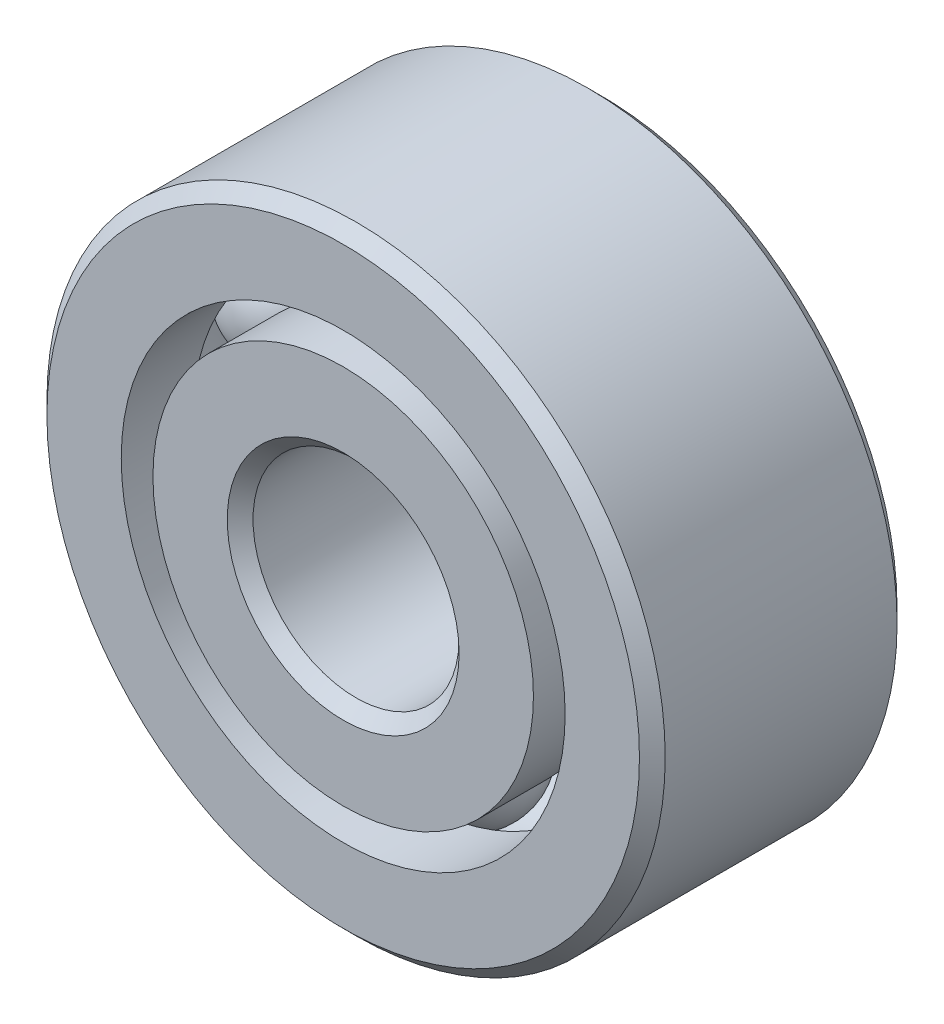
ISO-10303-21;
HEADER;
FILE_DESCRIPTION(('STEP AP214'),'2;1');
FILE_NAME('part.step','',(''),(''),'','','');
FILE_SCHEMA(('AUTOMOTIVE_DESIGN { 1 0 10303 214 1 1 1 1 }'));
ENDSEC;
DATA;
#1=APPLICATION_CONTEXT('core data for automotive mechanical design processes');
#2=APPLICATION_PROTOCOL_DEFINITION('international standard','automotive_design',2000,#1);
#3=PRODUCT_CONTEXT('',#1,'mechanical');
#4=PRODUCT('Part','Part','',(#3));
#5=PRODUCT_RELATED_PRODUCT_CATEGORY('part','',(#4));
#6=PRODUCT_DEFINITION_FORMATION('','',#4);
#7=PRODUCT_DEFINITION_CONTEXT('part definition',#1,'design');
#8=PRODUCT_DEFINITION('design','',#6,#7);
#9=PRODUCT_DEFINITION_SHAPE('','',#8);
#10=(LENGTH_UNIT() NAMED_UNIT(*) SI_UNIT(.MILLI.,.METRE.));
#11=(NAMED_UNIT(*) PLANE_ANGLE_UNIT() SI_UNIT($,.RADIAN.));
#12=(NAMED_UNIT(*) SI_UNIT($,.STERADIAN.) SOLID_ANGLE_UNIT());
#13=UNCERTAINTY_MEASURE_WITH_UNIT(LENGTH_MEASURE(1.E-05),#10,'distance_accuracy_value','');
#14=(GEOMETRIC_REPRESENTATION_CONTEXT(3) GLOBAL_UNCERTAINTY_ASSIGNED_CONTEXT((#13)) GLOBAL_UNIT_ASSIGNED_CONTEXT((#10,
#11,#12)) REPRESENTATION_CONTEXT('',''));
#15=CARTESIAN_POINT('',(0.,0.,0.));
#16=DIRECTION('',(0.,0.,1.));
#17=DIRECTION('',(1.,0.,0.));
#18=AXIS2_PLACEMENT_3D('',#15,#16,#17);
#19=CARTESIAN_POINT('',(-2.74963065701557,1.58750000000003,0.));
#20=DIRECTION('',(0.,0.,1.));
#21=DIRECTION('',(-0.866025403784433,0.50000000000001,0.));
#22=AXIS2_PLACEMENT_3D('',#19,#20,#21);
#23=SPHERICAL_SURFACE('',#22,0.915136422466876);
#24=CARTESIAN_POINT('',(-2.74963065701557,1.58750000000003,0.915136422466875));
#25=VERTEX_POINT('',#24);
#26=VERTEX_LOOP('',#25);
#27=FACE_BOUND('',#26,.T.);
#28=ADVANCED_FACE('F45',(#27),#23,.T.);
#29=CLOSED_SHELL('',(#28));
#30=MANIFOLD_SOLID_BREP('B2',#29);
#31=CARTESIAN_POINT('',(-2.74963065701561,-1.58749999999997,0.));
#32=DIRECTION('',(0.,0.,1.));
#33=DIRECTION('',(-0.866025403784443,-0.499999999999992,0.));
#34=AXIS2_PLACEMENT_3D('',#31,#32,#33);
#35=SPHERICAL_SURFACE('',#34,0.915136422466876);
#36=CARTESIAN_POINT('',(-2.74963065701561,-1.58749999999997,0.915136422466875));
#37=VERTEX_POINT('',#36);
#38=VERTEX_LOOP('',#37);
#39=FACE_BOUND('',#38,.T.);
#40=ADVANCED_FACE('F65',(#39),#35,.T.);
#41=CLOSED_SHELL('',(#40));
#42=MANIFOLD_SOLID_BREP('B6',#41);
#43=CARTESIAN_POINT('',(0.,-3.175,0.));
#44=DIRECTION('',(0.,0.,1.));
#45=DIRECTION('',(0.,-1.,0.));
#46=AXIS2_PLACEMENT_3D('',#43,#44,#45);
#47=SPHERICAL_SURFACE('',#46,0.915136422466876);
#48=CARTESIAN_POINT('',(0.,-3.175,0.915136422466875));
#49=VERTEX_POINT('',#48);
#50=VERTEX_LOOP('',#49);
#51=FACE_BOUND('',#50,.T.);
#52=ADVANCED_FACE('F85',(#51),#47,.T.);
#53=CLOSED_SHELL('',(#52));
#54=MANIFOLD_SOLID_BREP('B41',#53);
#55=CARTESIAN_POINT('',(2.74963065701559,-1.58750000000001,0.));
#56=DIRECTION('',(0.,0.,1.));
#57=DIRECTION('',(0.866025403784436,-0.500000000000004,0.));
#58=AXIS2_PLACEMENT_3D('',#55,#56,#57);
#59=SPHERICAL_SURFACE('',#58,0.915136422466876);
#60=CARTESIAN_POINT('',(2.74963065701559,-1.58750000000001,0.915136422466875));
#61=VERTEX_POINT('',#60);
#62=VERTEX_LOOP('',#61);
#63=FACE_BOUND('',#62,.T.);
#64=ADVANCED_FACE('F105',(#63),#59,.T.);
#65=CLOSED_SHELL('',(#64));
#66=MANIFOLD_SOLID_BREP('B61',#65);
#67=CARTESIAN_POINT('',(2.7496306570156,1.58749999999999,0.));
#68=DIRECTION('',(0.,0.,1.));
#69=DIRECTION('',(0.86602540378444,0.499999999999998,0.));
#70=AXIS2_PLACEMENT_3D('',#67,#68,#69);
#71=SPHERICAL_SURFACE('',#70,0.915136422466876);
#72=CARTESIAN_POINT('',(2.7496306570156,1.58749999999999,0.915136422466875));
#73=VERTEX_POINT('',#72);
#74=VERTEX_LOOP('',#73);
#75=FACE_BOUND('',#74,.T.);
#76=ADVANCED_FACE('F125',(#75),#71,.T.);
#77=CLOSED_SHELL('',(#76));
#78=MANIFOLD_SOLID_BREP('B81',#77);
#79=CARTESIAN_POINT('',(0.,3.175,0.));
#80=DIRECTION('',(0.,0.,1.));
#81=DIRECTION('',(0.,1.,0.));
#82=AXIS2_PLACEMENT_3D('',#79,#80,#81);
#83=SPHERICAL_SURFACE('',#82,0.915136422466876);
#84=CARTESIAN_POINT('',(0.,3.175,0.915136422466875));
#85=VERTEX_POINT('',#84);
#86=VERTEX_LOOP('',#85);
#87=FACE_BOUND('',#86,.T.);
#88=ADVANCED_FACE('F149',(#87),#83,.T.);
#89=CLOSED_SHELL('',(#88));
#90=MANIFOLD_SOLID_BREP('B101',#89);
#91=CARTESIAN_POINT('',(0.,2.93076923076923,1.984375));
#92=DIRECTION('',(0.,0.,-1.));
#93=DIRECTION('',(-1.,0.,0.));
#94=AXIS2_PLACEMENT_3D('',#91,#92,#93);
#95=PLANE('',#94);
#96=CARTESIAN_POINT('',(0.,0.,1.984375));
#97=DIRECTION('',(0.,0.,1.));
#98=DIRECTION('',(1.,0.,0.));
#99=AXIS2_PLACEMENT_3D('',#96,#97,#98);
#100=CIRCLE('',#99,1.7859375);
#101=CARTESIAN_POINT('',(1.7859375,0.,1.984375));
#102=VERTEX_POINT('',#101);
#103=EDGE_CURVE('E204',#102,#102,#100,.T.);
#104=ORIENTED_EDGE('',*,*,#103,.F.);
#105=EDGE_LOOP('',(#104));
#106=FACE_BOUND('',#105,.T.);
#107=CARTESIAN_POINT('',(0.,0.,1.984375));
#108=DIRECTION('',(0.,0.,1.));
#109=DIRECTION('',(1.,0.,0.));
#110=AXIS2_PLACEMENT_3D('',#107,#108,#109);
#111=CIRCLE('',#110,2.93076923076923);
#112=CARTESIAN_POINT('',(2.93076923076923,0.,1.984375));
#113=VERTEX_POINT('',#112);
#114=EDGE_CURVE('E148',#113,#113,#111,.T.);
#115=ORIENTED_EDGE('',*,*,#114,.T.);
#116=EDGE_LOOP('',(#115));
#117=FACE_BOUND('',#116,.T.);
#118=ADVANCED_FACE('F176',(#106,#117),#95,.F.);
#119=CARTESIAN_POINT('',(0.,0.,1.984375));
#120=DIRECTION('',(0.,0.,1.));
#121=DIRECTION('',(1.,0.,0.));
#122=AXIS2_PLACEMENT_3D('',#119,#120,#121);
#123=CYLINDRICAL_SURFACE('',#122,2.93076923076923);
#124=ORIENTED_EDGE('',*,*,#114,.F.);
#125=EDGE_LOOP('',(#124));
#126=FACE_BOUND('',#125,.T.);
#127=CARTESIAN_POINT('',(0.,0.,0.881944444444444));
#128=DIRECTION('',(0.,0.,1.));
#129=DIRECTION('',(1.,0.,0.));
#130=AXIS2_PLACEMENT_3D('',#127,#128,#129);
#131=CIRCLE('',#130,2.93076923076923);
#132=CARTESIAN_POINT('',(2.93076923076923,0.,0.881944444444444));
#133=VERTEX_POINT('',#132);
#134=EDGE_CURVE('E182',#133,#133,#131,.T.);
#135=ORIENTED_EDGE('',*,*,#134,.T.);
#136=EDGE_LOOP('',(#135));
#137=FACE_BOUND('',#136,.T.);
#138=ADVANCED_FACE('F211',(#126,#137),#123,.T.);
#139=CARTESIAN_POINT('',(0.,0.,0.));
#140=DIRECTION('',(0.,0.,1.));
#141=DIRECTION('',(1.,0.,0.));
#142=AXIS2_PLACEMENT_3D('',#139,#140,#141);
#143=TOROIDAL_SURFACE('',#142,3.175,0.915136422466874);
#144=ORIENTED_EDGE('',*,*,#134,.F.);
#145=EDGE_LOOP('',(#144));
#146=FACE_BOUND('',#145,.T.);
#147=CARTESIAN_POINT('',(0.,0.,-0.881944444444445));
#148=DIRECTION('',(0.,0.,1.));
#149=DIRECTION('',(1.,0.,0.));
#150=AXIS2_PLACEMENT_3D('',#147,#148,#149);
#151=CIRCLE('',#150,2.93076923076923);
#152=CARTESIAN_POINT('',(2.93076923076923,0.,-0.881944444444445));
#153=VERTEX_POINT('',#152);
#154=EDGE_CURVE('E186',#153,#153,#151,.T.);
#155=ORIENTED_EDGE('',*,*,#154,.T.);
#156=EDGE_LOOP('',(#155));
#157=FACE_BOUND('',#156,.T.);
#158=ADVANCED_FACE('F215',(#146,#157),#143,.F.);
#159=CARTESIAN_POINT('',(0.,0.,1.984375));
#160=DIRECTION('',(0.,0.,1.));
#161=DIRECTION('',(1.,0.,0.));
#162=AXIS2_PLACEMENT_3D('',#159,#160,#161);
#163=CYLINDRICAL_SURFACE('',#162,2.93076923076923);
#164=ORIENTED_EDGE('',*,*,#154,.F.);
#165=EDGE_LOOP('',(#164));
#166=FACE_BOUND('',#165,.T.);
#167=CARTESIAN_POINT('',(0.,0.,-1.984375));
#168=DIRECTION('',(0.,0.,1.));
#169=DIRECTION('',(1.,0.,0.));
#170=AXIS2_PLACEMENT_3D('',#167,#168,#169);
#171=CIRCLE('',#170,2.93076923076923);
#172=CARTESIAN_POINT('',(2.93076923076923,0.,-1.984375));
#173=VERTEX_POINT('',#172);
#174=EDGE_CURVE('E190',#173,#173,#171,.T.);
#175=ORIENTED_EDGE('',*,*,#174,.T.);
#176=EDGE_LOOP('',(#175));
#177=FACE_BOUND('',#176,.T.);
#178=ADVANCED_FACE('F220',(#166,#177),#163,.T.);
#179=CARTESIAN_POINT('',(0.,1.7859375,-1.984375));
#180=DIRECTION('',(0.,0.,1.));
#181=DIRECTION('',(1.,0.,0.));
#182=AXIS2_PLACEMENT_3D('',#179,#180,#181);
#183=PLANE('',#182);
#184=ORIENTED_EDGE('',*,*,#174,.F.);
#185=EDGE_LOOP('',(#184));
#186=FACE_BOUND('',#185,.T.);
#187=CARTESIAN_POINT('',(0.,0.,-1.984375));
#188=DIRECTION('',(0.,0.,1.));
#189=DIRECTION('',(1.,0.,0.));
#190=AXIS2_PLACEMENT_3D('',#187,#188,#189);
#191=CIRCLE('',#190,1.7859375);
#192=CARTESIAN_POINT('',(1.7859375,0.,-1.984375));
#193=VERTEX_POINT('',#192);
#194=EDGE_CURVE('E195',#193,#193,#191,.T.);
#195=ORIENTED_EDGE('',*,*,#194,.T.);
#196=EDGE_LOOP('',(#195));
#197=FACE_BOUND('',#196,.T.);
#198=ADVANCED_FACE('F226',(#186,#197),#183,.F.);
#199=CARTESIAN_POINT('',(0.,0.,-1.7859375));
#200=DIRECTION('',(0.,0.,-1.));
#201=DIRECTION('',(-1.,0.,0.));
#202=AXIS2_PLACEMENT_3D('',#199,#200,#201);
#203=CONICAL_SURFACE('',#202,1.5875,0.785398163397443);
#204=ORIENTED_EDGE('',*,*,#194,.F.);
#205=EDGE_LOOP('',(#204));
#206=FACE_BOUND('',#205,.T.);
#207=CARTESIAN_POINT('',(0.,0.,-1.7859375));
#208=DIRECTION('',(0.,0.,1.));
#209=DIRECTION('',(1.,0.,0.));
#210=AXIS2_PLACEMENT_3D('',#207,#208,#209);
#211=CIRCLE('',#210,1.5875);
#212=CARTESIAN_POINT('',(1.5875,0.,-1.7859375));
#213=VERTEX_POINT('',#212);
#214=EDGE_CURVE('E198',#213,#213,#211,.T.);
#215=ORIENTED_EDGE('',*,*,#214,.T.);
#216=EDGE_LOOP('',(#215));
#217=FACE_BOUND('',#216,.T.);
#218=ADVANCED_FACE('F230',(#206,#217),#203,.F.);
#219=CARTESIAN_POINT('',(0.,0.,1.984375));
#220=DIRECTION('',(0.,0.,1.));
#221=DIRECTION('',(1.,0.,0.));
#222=AXIS2_PLACEMENT_3D('',#219,#220,#221);
#223=CYLINDRICAL_SURFACE('',#222,1.5875);
#224=ORIENTED_EDGE('',*,*,#214,.F.);
#225=EDGE_LOOP('',(#224));
#226=FACE_BOUND('',#225,.T.);
#227=CARTESIAN_POINT('',(0.,0.,1.7859375));
#228=DIRECTION('',(0.,0.,1.));
#229=DIRECTION('',(1.,0.,0.));
#230=AXIS2_PLACEMENT_3D('',#227,#228,#229);
#231=CIRCLE('',#230,1.5875);
#232=CARTESIAN_POINT('',(1.5875,0.,1.7859375));
#233=VERTEX_POINT('',#232);
#234=EDGE_CURVE('E201',#233,#233,#231,.T.);
#235=ORIENTED_EDGE('',*,*,#234,.T.);
#236=EDGE_LOOP('',(#235));
#237=FACE_BOUND('',#236,.T.);
#238=ADVANCED_FACE('F234',(#226,#237),#223,.F.);
#239=CARTESIAN_POINT('',(0.,0.,1.984375));
#240=DIRECTION('',(0.,0.,1.));
#241=DIRECTION('',(1.,0.,0.));
#242=AXIS2_PLACEMENT_3D('',#239,#240,#241);
#243=CONICAL_SURFACE('',#242,1.7859375,0.785398163397453);
#244=ORIENTED_EDGE('',*,*,#234,.F.);
#245=EDGE_LOOP('',(#244));
#246=FACE_BOUND('',#245,.T.);
#247=ORIENTED_EDGE('',*,*,#103,.T.);
#248=EDGE_LOOP('',(#247));
#249=FACE_BOUND('',#248,.T.);
#250=ADVANCED_FACE('F208',(#246,#249),#243,.F.);
#251=CLOSED_SHELL('',(#118,#138,#158,#178,#198,#218,#238,#250));
#252=MANIFOLD_SOLID_BREP('B121',#251);
#253=CARTESIAN_POINT('',(0.,0.,1.7859375));
#254=DIRECTION('',(0.,0.,-1.));
#255=DIRECTION('',(-1.,0.,0.));
#256=AXIS2_PLACEMENT_3D('',#253,#254,#255);
#257=CONICAL_SURFACE('',#256,4.7625,0.785398163397445);
#258=CARTESIAN_POINT('',(0.,0.,1.984375));
#259=DIRECTION('',(0.,0.,1.));
#260=DIRECTION('',(1.,0.,0.));
#261=AXIS2_PLACEMENT_3D('',#258,#259,#260);
#262=CIRCLE('',#261,4.5640625);
#263=CARTESIAN_POINT('',(4.5640625,0.,1.984375));
#264=VERTEX_POINT('',#263);
#265=EDGE_CURVE('E331',#264,#264,#262,.T.);
#266=ORIENTED_EDGE('',*,*,#265,.F.);
#267=EDGE_LOOP('',(#266));
#268=FACE_BOUND('',#267,.T.);
#269=CARTESIAN_POINT('',(0.,0.,1.7859375));
#270=DIRECTION('',(0.,0.,1.));
#271=DIRECTION('',(1.,0.,0.));
#272=AXIS2_PLACEMENT_3D('',#269,#270,#271);
#273=CIRCLE('',#272,4.7625);
#274=CARTESIAN_POINT('',(4.7625,0.,1.7859375));
#275=VERTEX_POINT('',#274);
#276=EDGE_CURVE('E175',#275,#275,#273,.T.);
#277=ORIENTED_EDGE('',*,*,#276,.T.);
#278=EDGE_LOOP('',(#277));
#279=FACE_BOUND('',#278,.T.);
#280=ADVANCED_FACE('F303',(#268,#279),#257,.T.);
#281=CARTESIAN_POINT('',(0.,0.,1.984375));
#282=DIRECTION('',(0.,0.,1.));
#283=DIRECTION('',(1.,0.,0.));
#284=AXIS2_PLACEMENT_3D('',#281,#282,#283);
#285=CYLINDRICAL_SURFACE('',#284,4.7625);
#286=ORIENTED_EDGE('',*,*,#276,.F.);
#287=EDGE_LOOP('',(#286));
#288=FACE_BOUND('',#287,.T.);
#289=CARTESIAN_POINT('',(0.,0.,-1.7859375));
#290=DIRECTION('',(0.,0.,1.));
#291=DIRECTION('',(1.,0.,0.));
#292=AXIS2_PLACEMENT_3D('',#289,#290,#291);
#293=CIRCLE('',#292,4.7625);
#294=CARTESIAN_POINT('',(4.7625,0.,-1.7859375));
#295=VERTEX_POINT('',#294);
#296=EDGE_CURVE('E309',#295,#295,#293,.T.);
#297=ORIENTED_EDGE('',*,*,#296,.T.);
#298=EDGE_LOOP('',(#297));
#299=FACE_BOUND('',#298,.T.);
#300=ADVANCED_FACE('F338',(#288,#299),#285,.T.);
#301=CARTESIAN_POINT('',(0.,0.,-1.984375));
#302=DIRECTION('',(0.,0.,1.));
#303=DIRECTION('',(1.,0.,0.));
#304=AXIS2_PLACEMENT_3D('',#301,#302,#303);
#305=CONICAL_SURFACE('',#304,4.5640625,0.785398163397444);
#306=ORIENTED_EDGE('',*,*,#296,.F.);
#307=EDGE_LOOP('',(#306));
#308=FACE_BOUND('',#307,.T.);
#309=CARTESIAN_POINT('',(0.,0.,-1.984375));
#310=DIRECTION('',(0.,0.,1.));
#311=DIRECTION('',(1.,0.,0.));
#312=AXIS2_PLACEMENT_3D('',#309,#310,#311);
#313=CIRCLE('',#312,4.5640625);
#314=CARTESIAN_POINT('',(4.5640625,0.,-1.984375));
#315=VERTEX_POINT('',#314);
#316=EDGE_CURVE('E313',#315,#315,#313,.T.);
#317=ORIENTED_EDGE('',*,*,#316,.T.);
#318=EDGE_LOOP('',(#317));
#319=FACE_BOUND('',#318,.T.);
#320=ADVANCED_FACE('F342',(#308,#319),#305,.T.);
#321=CARTESIAN_POINT('',(0.,4.5640625,-1.984375));
#322=DIRECTION('',(0.,0.,1.));
#323=DIRECTION('',(1.,0.,0.));
#324=AXIS2_PLACEMENT_3D('',#321,#322,#323);
#325=PLANE('',#324);
#326=ORIENTED_EDGE('',*,*,#316,.F.);
#327=EDGE_LOOP('',(#326));
#328=FACE_BOUND('',#327,.T.);
#329=CARTESIAN_POINT('',(0.,0.,-1.984375));
#330=DIRECTION('',(0.,0.,1.));
#331=DIRECTION('',(1.,0.,0.));
#332=AXIS2_PLACEMENT_3D('',#329,#330,#331);
#333=CIRCLE('',#332,3.41923076923077);
#334=CARTESIAN_POINT('',(3.41923076923077,0.,-1.984375));
#335=VERTEX_POINT('',#334);
#336=EDGE_CURVE('E317',#335,#335,#333,.T.);
#337=ORIENTED_EDGE('',*,*,#336,.T.);
#338=EDGE_LOOP('',(#337));
#339=FACE_BOUND('',#338,.T.);
#340=ADVANCED_FACE('F347',(#328,#339),#325,.F.);
#341=CARTESIAN_POINT('',(0.,0.,1.984375));
#342=DIRECTION('',(0.,0.,1.));
#343=DIRECTION('',(1.,0.,0.));
#344=AXIS2_PLACEMENT_3D('',#341,#342,#343);
#345=CYLINDRICAL_SURFACE('',#344,3.41923076923077);
#346=ORIENTED_EDGE('',*,*,#336,.F.);
#347=EDGE_LOOP('',(#346));
#348=FACE_BOUND('',#347,.T.);
#349=CARTESIAN_POINT('',(0.,0.,-0.881944444444445));
#350=DIRECTION('',(0.,0.,1.));
#351=DIRECTION('',(1.,0.,0.));
#352=AXIS2_PLACEMENT_3D('',#349,#350,#351);
#353=CIRCLE('',#352,3.41923076923077);
#354=CARTESIAN_POINT('',(3.41923076923077,0.,-0.881944444444445));
#355=VERTEX_POINT('',#354);
#356=EDGE_CURVE('E322',#355,#355,#353,.T.);
#357=ORIENTED_EDGE('',*,*,#356,.T.);
#358=EDGE_LOOP('',(#357));
#359=FACE_BOUND('',#358,.T.);
#360=ADVANCED_FACE('F353',(#348,#359),#345,.F.);
#361=CARTESIAN_POINT('',(0.,0.,0.));
#362=DIRECTION('',(0.,0.,1.));
#363=DIRECTION('',(1.,0.,0.));
#364=AXIS2_PLACEMENT_3D('',#361,#362,#363);
#365=TOROIDAL_SURFACE('',#364,3.175,0.915136422466876);
#366=ORIENTED_EDGE('',*,*,#356,.F.);
#367=EDGE_LOOP('',(#366));
#368=FACE_BOUND('',#367,.T.);
#369=CARTESIAN_POINT('',(0.,0.,0.881944444444444));
#370=DIRECTION('',(0.,0.,1.));
#371=DIRECTION('',(1.,0.,0.));
#372=AXIS2_PLACEMENT_3D('',#369,#370,#371);
#373=CIRCLE('',#372,3.41923076923077);
#374=CARTESIAN_POINT('',(3.41923076923077,0.,0.881944444444444));
#375=VERTEX_POINT('',#374);
#376=EDGE_CURVE('E325',#375,#375,#373,.T.);
#377=ORIENTED_EDGE('',*,*,#376,.T.);
#378=EDGE_LOOP('',(#377));
#379=FACE_BOUND('',#378,.T.);
#380=ADVANCED_FACE('F357',(#368,#379),#365,.F.);
#381=CARTESIAN_POINT('',(0.,0.,1.984375));
#382=DIRECTION('',(0.,0.,1.));
#383=DIRECTION('',(1.,0.,0.));
#384=AXIS2_PLACEMENT_3D('',#381,#382,#383);
#385=CYLINDRICAL_SURFACE('',#384,3.41923076923077);
#386=ORIENTED_EDGE('',*,*,#376,.F.);
#387=EDGE_LOOP('',(#386));
#388=FACE_BOUND('',#387,.T.);
#389=CARTESIAN_POINT('',(0.,0.,1.984375));
#390=DIRECTION('',(0.,0.,1.));
#391=DIRECTION('',(1.,0.,0.));
#392=AXIS2_PLACEMENT_3D('',#389,#390,#391);
#393=CIRCLE('',#392,3.41923076923077);
#394=CARTESIAN_POINT('',(3.41923076923077,0.,1.984375));
#395=VERTEX_POINT('',#394);
#396=EDGE_CURVE('E328',#395,#395,#393,.T.);
#397=ORIENTED_EDGE('',*,*,#396,.T.);
#398=EDGE_LOOP('',(#397));
#399=FACE_BOUND('',#398,.T.);
#400=ADVANCED_FACE('F361',(#388,#399),#385,.F.);
#401=CARTESIAN_POINT('',(0.,4.5640625,1.984375));
#402=DIRECTION('',(0.,0.,-1.));
#403=DIRECTION('',(-1.,0.,0.));
#404=AXIS2_PLACEMENT_3D('',#401,#402,#403);
#405=PLANE('',#404);
#406=ORIENTED_EDGE('',*,*,#396,.F.);
#407=EDGE_LOOP('',(#406));
#408=FACE_BOUND('',#407,.T.);
#409=ORIENTED_EDGE('',*,*,#265,.T.);
#410=EDGE_LOOP('',(#409));
#411=FACE_BOUND('',#410,.T.);
#412=ADVANCED_FACE('F335',(#408,#411),#405,.F.);
#413=CLOSED_SHELL('',(#280,#300,#320,#340,#360,#380,#400,#412));
#414=MANIFOLD_SOLID_BREP('B143',#413);
#415=ADVANCED_BREP_SHAPE_REPRESENTATION('',(#18,#30,#42,#54,#66,#78,#90,#252,#414),#14);
#416=SHAPE_DEFINITION_REPRESENTATION(#9,#415);
ENDSEC;
END-ISO-10303-21;
